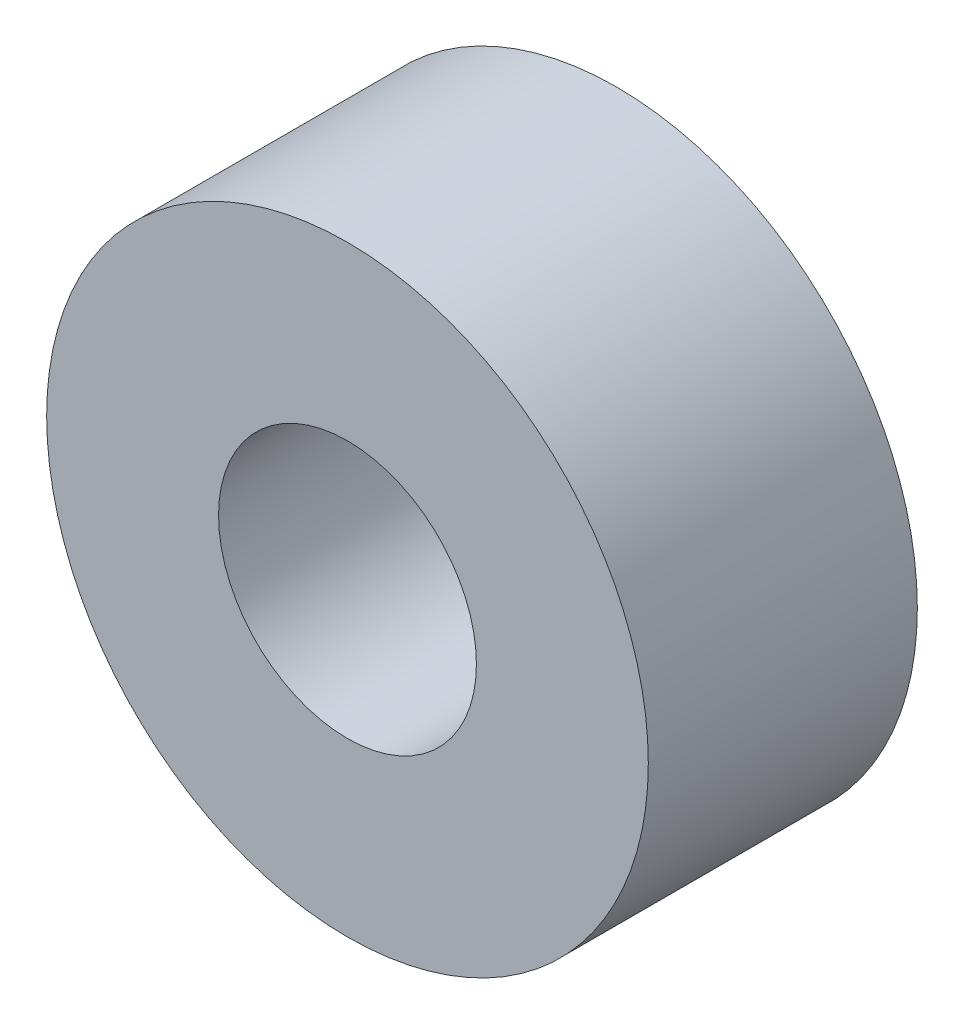
ISO-10303-21;
HEADER;
FILE_DESCRIPTION(('STEP AP214'),'2;1');
FILE_NAME('part.step','',(''),(''),'','','');
FILE_SCHEMA(('AUTOMOTIVE_DESIGN { 1 0 10303 214 1 1 1 1 }'));
ENDSEC;
DATA;
#1=APPLICATION_CONTEXT('core data for automotive mechanical design processes');
#2=APPLICATION_PROTOCOL_DEFINITION('international standard','automotive_design',2000,#1);
#3=PRODUCT_CONTEXT('',#1,'mechanical');
#4=PRODUCT('Part','Part','',(#3));
#5=PRODUCT_RELATED_PRODUCT_CATEGORY('part','',(#4));
#6=PRODUCT_DEFINITION_FORMATION('','',#4);
#7=PRODUCT_DEFINITION_CONTEXT('part definition',#1,'design');
#8=PRODUCT_DEFINITION('design','',#6,#7);
#9=PRODUCT_DEFINITION_SHAPE('','',#8);
#10=(LENGTH_UNIT() NAMED_UNIT(*) SI_UNIT(.MILLI.,.METRE.));
#11=(NAMED_UNIT(*) PLANE_ANGLE_UNIT() SI_UNIT($,.RADIAN.));
#12=(NAMED_UNIT(*) SI_UNIT($,.STERADIAN.) SOLID_ANGLE_UNIT());
#13=UNCERTAINTY_MEASURE_WITH_UNIT(LENGTH_MEASURE(1.E-05),#10,'distance_accuracy_value','');
#14=(GEOMETRIC_REPRESENTATION_CONTEXT(3) GLOBAL_UNCERTAINTY_ASSIGNED_CONTEXT((#13)) GLOBAL_UNIT_ASSIGNED_CONTEXT((#10,
#11,#12)) REPRESENTATION_CONTEXT('',''));
#15=CARTESIAN_POINT('',(0.,0.,0.));
#16=DIRECTION('',(0.,0.,1.));
#17=DIRECTION('',(1.,0.,0.));
#18=AXIS2_PLACEMENT_3D('',#15,#16,#17);
#19=CARTESIAN_POINT('',(0.,0.,7.9502));
#20=DIRECTION('',(0.,0.,1.));
#21=DIRECTION('',(1.,0.,0.));
#22=AXIS2_PLACEMENT_3D('',#19,#20,#21);
#23=PLANE('',#22);
#24=CARTESIAN_POINT('',(0.,0.,7.9502));
#25=DIRECTION('',(0.,0.,1.));
#26=DIRECTION('',(1.,0.,0.));
#27=AXIS2_PLACEMENT_3D('',#24,#25,#26);
#28=CIRCLE('',#27,8.89);
#29=CARTESIAN_POINT('',(8.89,0.,7.9502));
#30=VERTEX_POINT('',#29);
#31=EDGE_CURVE('E10',#30,#30,#28,.T.);
#32=ORIENTED_EDGE('',*,*,#31,.T.);
#33=EDGE_LOOP('',(#32));
#34=FACE_BOUND('',#33,.T.);
#35=CARTESIAN_POINT('',(0.,0.,7.9502));
#36=DIRECTION('',(0.,0.,1.));
#37=DIRECTION('',(1.,0.,0.));
#38=AXIS2_PLACEMENT_3D('',#35,#36,#37);
#39=CIRCLE('',#38,3.81);
#40=CARTESIAN_POINT('',(3.81,0.,7.9502));
#41=VERTEX_POINT('',#40);
#42=EDGE_CURVE('E45',#41,#41,#39,.T.);
#43=ORIENTED_EDGE('',*,*,#42,.F.);
#44=EDGE_LOOP('',(#43));
#45=FACE_BOUND('',#44,.T.);
#46=ADVANCED_FACE('F34',(#34,#45),#23,.T.);
#47=CARTESIAN_POINT('',(0.,0.,0.));
#48=DIRECTION('',(0.,0.,1.));
#49=DIRECTION('',(1.,0.,0.));
#50=AXIS2_PLACEMENT_3D('',#47,#48,#49);
#51=PLANE('',#50);
#52=CARTESIAN_POINT('',(0.,0.,0.));
#53=DIRECTION('',(0.,0.,1.));
#54=DIRECTION('',(1.,0.,0.));
#55=AXIS2_PLACEMENT_3D('',#52,#53,#54);
#56=CIRCLE('',#55,8.89);
#57=CARTESIAN_POINT('',(8.89,0.,0.));
#58=VERTEX_POINT('',#57);
#59=EDGE_CURVE('E38',#58,#58,#56,.T.);
#60=ORIENTED_EDGE('',*,*,#59,.F.);
#61=EDGE_LOOP('',(#60));
#62=FACE_BOUND('',#61,.T.);
#63=CARTESIAN_POINT('',(0.,0.,0.));
#64=DIRECTION('',(0.,0.,1.));
#65=DIRECTION('',(1.,0.,0.));
#66=AXIS2_PLACEMENT_3D('',#63,#64,#65);
#67=CIRCLE('',#66,3.81);
#68=CARTESIAN_POINT('',(3.81,0.,0.));
#69=VERTEX_POINT('',#68);
#70=EDGE_CURVE('E47',#69,#69,#67,.T.);
#71=ORIENTED_EDGE('',*,*,#70,.T.);
#72=EDGE_LOOP('',(#71));
#73=FACE_BOUND('',#72,.T.);
#74=ADVANCED_FACE('F57',(#62,#73),#51,.F.);
#75=CARTESIAN_POINT('',(0.,0.,7.9502));
#76=DIRECTION('',(0.,0.,-1.));
#77=DIRECTION('',(-1.,0.,0.));
#78=AXIS2_PLACEMENT_3D('',#75,#76,#77);
#79=CYLINDRICAL_SURFACE('',#78,8.89);
#80=ORIENTED_EDGE('',*,*,#31,.F.);
#81=EDGE_LOOP('',(#80));
#82=FACE_BOUND('',#81,.T.);
#83=ORIENTED_EDGE('',*,*,#59,.T.);
#84=EDGE_LOOP('',(#83));
#85=FACE_BOUND('',#84,.T.);
#86=ADVANCED_FACE('F36',(#82,#85),#79,.T.);
#87=CARTESIAN_POINT('',(0.,0.,7.9502));
#88=DIRECTION('',(0.,0.,-1.));
#89=DIRECTION('',(-1.,0.,0.));
#90=AXIS2_PLACEMENT_3D('',#87,#88,#89);
#91=CYLINDRICAL_SURFACE('',#90,3.81);
#92=ORIENTED_EDGE('',*,*,#42,.T.);
#93=EDGE_LOOP('',(#92));
#94=FACE_BOUND('',#93,.T.);
#95=ORIENTED_EDGE('',*,*,#70,.F.);
#96=EDGE_LOOP('',(#95));
#97=FACE_BOUND('',#96,.T.);
#98=ADVANCED_FACE('F53',(#94,#97),#91,.F.);
#99=CLOSED_SHELL('',(#46,#74,#86,#98));
#100=MANIFOLD_SOLID_BREP('B2',#99);
#101=ADVANCED_BREP_SHAPE_REPRESENTATION('',(#18,#100),#14);
#102=SHAPE_DEFINITION_REPRESENTATION(#9,#101);
ENDSEC;
END-ISO-10303-21;
